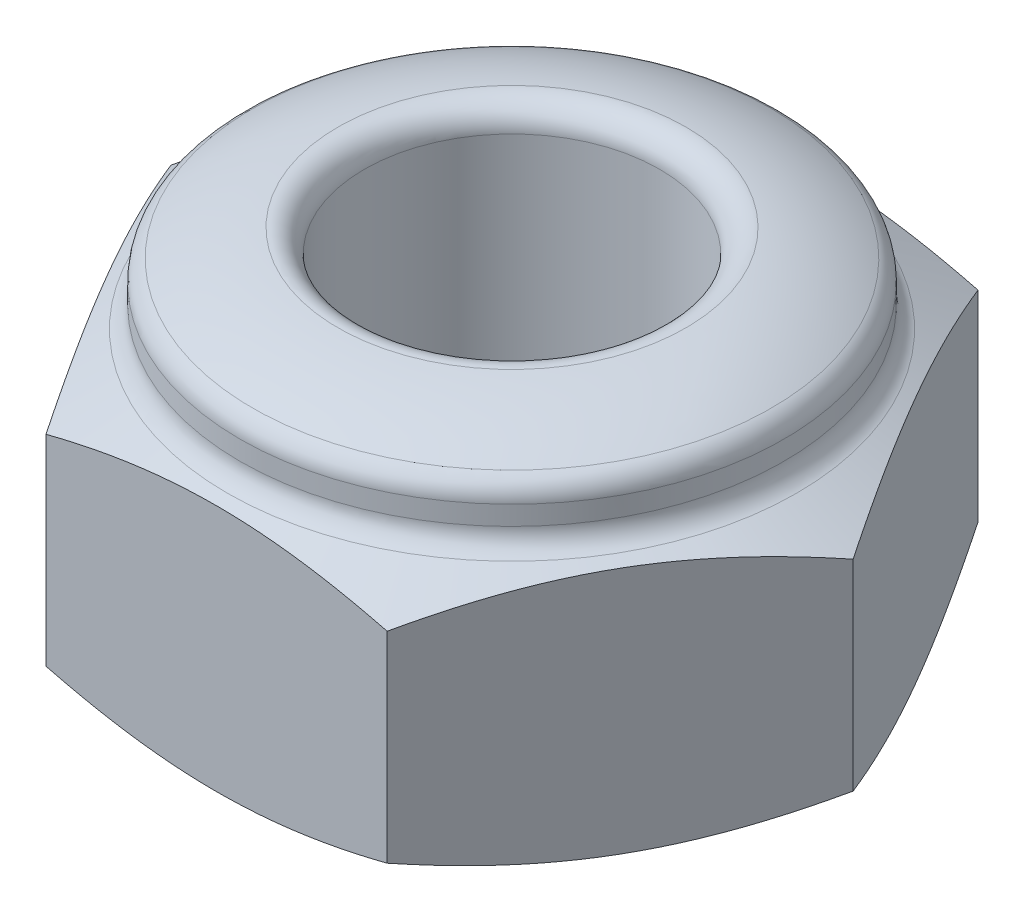
ISO-10303-21;
HEADER;
FILE_DESCRIPTION(('STEP AP214'),'2;1');
FILE_NAME('part.step','',(''),(''),'','','');
FILE_SCHEMA(('AUTOMOTIVE_DESIGN { 1 0 10303 214 1 1 1 1 }'));
ENDSEC;
DATA;
#1=APPLICATION_CONTEXT('core data for automotive mechanical design processes');
#2=APPLICATION_PROTOCOL_DEFINITION('international standard','automotive_design',2000,#1);
#3=PRODUCT_CONTEXT('',#1,'mechanical');
#4=PRODUCT('Part','Part','',(#3));
#5=PRODUCT_RELATED_PRODUCT_CATEGORY('part','',(#4));
#6=PRODUCT_DEFINITION_FORMATION('','',#4);
#7=PRODUCT_DEFINITION_CONTEXT('part definition',#1,'design');
#8=PRODUCT_DEFINITION('design','',#6,#7);
#9=PRODUCT_DEFINITION_SHAPE('','',#8);
#10=(LENGTH_UNIT() NAMED_UNIT(*) SI_UNIT(.MILLI.,.METRE.));
#11=(NAMED_UNIT(*) PLANE_ANGLE_UNIT() SI_UNIT($,.RADIAN.));
#12=(NAMED_UNIT(*) SI_UNIT($,.STERADIAN.) SOLID_ANGLE_UNIT());
#13=UNCERTAINTY_MEASURE_WITH_UNIT(LENGTH_MEASURE(1.E-05),#10,'distance_accuracy_value','');
#14=(GEOMETRIC_REPRESENTATION_CONTEXT(3) GLOBAL_UNCERTAINTY_ASSIGNED_CONTEXT((#13)) GLOBAL_UNIT_ASSIGNED_CONTEXT((#10,
#11,#12)) REPRESENTATION_CONTEXT('',''));
#15=CARTESIAN_POINT('',(0.,0.,0.));
#16=DIRECTION('',(0.,0.,1.));
#17=DIRECTION('',(1.,0.,0.));
#18=AXIS2_PLACEMENT_3D('',#15,#16,#17);
#19=CARTESIAN_POINT('',(0.,-1.15,0.));
#20=DIRECTION('',(0.,1.,0.));
#21=DIRECTION('',(0.,0.,1.));
#22=AXIS2_PLACEMENT_3D('',#19,#20,#21);
#23=PLANE('',#22);
#24=CARTESIAN_POINT('',(0.,-1.15,0.));
#25=DIRECTION('',(0.,1.,0.));
#26=DIRECTION('',(0.,0.,1.));
#27=AXIS2_PLACEMENT_3D('',#24,#25,#26);
#28=CIRCLE('',#27,1.25);
#29=CARTESIAN_POINT('',(0.,-1.15,1.25));
#30=VERTEX_POINT('',#29);
#31=EDGE_CURVE('E235',#30,#30,#28,.T.);
#32=ORIENTED_EDGE('',*,*,#31,.T.);
#33=EDGE_LOOP('',(#32));
#34=FACE_BOUND('',#33,.T.);
#35=CARTESIAN_POINT('',(0.,-1.15,0.));
#36=DIRECTION('',(0.,1.,0.));
#37=DIRECTION('',(0.,0.,1.));
#38=AXIS2_PLACEMENT_3D('',#35,#36,#37);
#39=CIRCLE('',#38,2.30000000000003);
#40=CARTESIAN_POINT('',(0.,-1.15,2.30000000000003));
#41=VERTEX_POINT('',#40);
#42=EDGE_CURVE('E238',#41,#41,#39,.T.);
#43=ORIENTED_EDGE('',*,*,#42,.F.);
#44=EDGE_LOOP('',(#43));
#45=FACE_BOUND('',#44,.T.);
#46=ADVANCED_FACE('F35',(#34,#45),#23,.F.);
#47=CARTESIAN_POINT('',(1.44337567297409,1.15,2.49999999999999));
#48=DIRECTION('',(-0.866025403784441,0.,-0.499999999999995));
#49=DIRECTION('',(-0.499999999999995,0.,0.866025403784442));
#50=AXIS2_PLACEMENT_3D('',#47,#48,#49);
#51=PLANE('',#50);
#52=DIRECTION('',(0.,-1.,0.));
#53=VECTOR('',#52,1.);
#54=CARTESIAN_POINT('',(1.44337567297409,1.15,2.49999999999999));
#55=LINE('',#54,#53);
#56=CARTESIAN_POINT('',(1.44337567297417,0.85,2.49999999999999));
#57=VERTEX_POINT('',#56);
#58=CARTESIAN_POINT('',(1.44337567297409,-0.850000000000019,2.49999999999999));
#59=VERTEX_POINT('',#58);
#60=EDGE_CURVE('E102',#57,#59,#55,.T.);
#61=ORIENTED_EDGE('',*,*,#60,.T.);
#62=CARTESIAN_POINT('',(1.44326020292026,-0.849940957792842,2.50019999999999));
#63=CARTESIAN_POINT('',(1.48304200436103,-0.870275913021248,2.43129589868794));
#64=CARTESIAN_POINT('',(1.52297171977333,-0.88943828497677,2.36213560286208));
#65=CARTESIAN_POINT('',(1.60315528144172,-0.925022276588077,2.22325360012059));
#66=CARTESIAN_POINT('',(1.64340928110925,-0.941442508167529,2.15353162748857));
#67=CARTESIAN_POINT('',(1.7647467778341,-0.98600599889985,1.9433689182979));
#68=CARTESIAN_POINT('',(1.84630037490682,-1.00939599507613,1.80211394462795));
#69=CARTESIAN_POINT('',(1.96821494245454,-1.03261787149011,1.5909517194525));
#70=CARTESIAN_POINT('',(2.008307412772,-1.03838013773711,1.52150952386173));
#71=CARTESIAN_POINT('',(2.08858324859441,-1.0460025287005,1.38246769759725));
#72=CARTESIAN_POINT('',(2.12876660075624,-1.0478631931826,1.31286809003452));
#73=CARTESIAN_POINT('',(2.20908795497129,-1.04760865942046,1.17374742360132));
#74=CARTESIAN_POINT('',(2.24922596105515,-1.04549755958155,1.10422635774957));
#75=CARTESIAN_POINT('',(2.32939940188051,-1.03738839638708,0.965361884822419));
#76=CARTESIAN_POINT('',(2.3694348448531,-1.03139065542793,0.896018463490371));
#77=CARTESIAN_POINT('',(2.44942482862501,-1.01570084263161,0.757471747500809));
#78=CARTESIAN_POINT('',(2.48937890672737,-1.0059994399089,0.688269254257944));
#79=CARTESIAN_POINT('',(2.56904987868748,-0.983213414244998,0.550275082934642));
#80=CARTESIAN_POINT('',(2.60876673138533,-0.970128220698126,0.481483476145227));
#81=CARTESIAN_POINT('',(2.68840407449965,-0.940762434342736,0.343547551691429));
#82=CARTESIAN_POINT('',(2.72832109885332,-0.924444659193758,0.274409237423899));
#83=CARTESIAN_POINT('',(2.80783255799786,-0.889116076286036,0.136691350401629));
#84=CARTESIAN_POINT('',(2.84742716860096,-0.870106856989903,0.0681114731311524));
#85=CARTESIAN_POINT('',(2.88686681600197,-0.849940957792858,-0.00020000000000055));
#86=B_SPLINE_CURVE_WITH_KNOTS('',3,(#62,#63,#64,#65,#66,#67,#68,#69,#70,#71,#72,#73,#74,#75,#76,
#77,#78,#79,#80,#81,#82,#83,#84,#85),.UNSPECIFIED.,.F.,.F.,(4,2,2,2,2,2,2,2,2,2,2,4),(0.,
0.246339561475915,0.492803444956308,0.986384137280997,1.22748103973818,1.46854458552913,
1.70935951780852,1.9501544770742,2.19156013413322,2.43300652579168,2.6774108286129,
2.9216714831912),.UNSPECIFIED.);
#87=CARTESIAN_POINT('',(2.88675134594818,-0.85,0.));
#88=VERTEX_POINT('',#87);
#89=EDGE_CURVE('E50',#59,#88,#86,.T.);
#90=ORIENTED_EDGE('',*,*,#89,.T.);
#91=DIRECTION('',(0.,-1.,0.));
#92=VECTOR('',#91,1.);
#93=CARTESIAN_POINT('',(2.88675134594813,1.15,0.));
#94=LINE('',#93,#92);
#95=CARTESIAN_POINT('',(2.88675134594818,0.85,0.));
#96=VERTEX_POINT('',#95);
#97=EDGE_CURVE('E100',#96,#88,#94,.T.);
#98=ORIENTED_EDGE('',*,*,#97,.F.);
#99=CARTESIAN_POINT('',(2.88686681600197,0.849940957792849,-0.00019999999999984));
#100=CARTESIAN_POINT('',(2.84708501456119,0.870275913021254,0.0687041013120405));
#101=CARTESIAN_POINT('',(2.8071552991489,0.889438284976776,0.137864397137907));
#102=CARTESIAN_POINT('',(2.72697173748051,0.925022276588082,0.27674639987939));
#103=CARTESIAN_POINT('',(2.68671773781298,0.941442508167534,0.346468372511408));
#104=CARTESIAN_POINT('',(2.56538024108813,0.986005998899853,0.556631081702078));
#105=CARTESIAN_POINT('',(2.48382664401541,1.00939599507613,0.697886055372031));
#106=CARTESIAN_POINT('',(2.36191207646768,1.03261787149011,0.909048280547479));
#107=CARTESIAN_POINT('',(2.32181960615023,1.03838013773711,0.978490476138252));
#108=CARTESIAN_POINT('',(2.24154377032782,1.0460025287005,1.11753230240273));
#109=CARTESIAN_POINT('',(2.20136041816599,1.0478631931826,1.18713190996545));
#110=CARTESIAN_POINT('',(2.12103906395094,1.04760865942046,1.32625257639866));
#111=CARTESIAN_POINT('',(2.08090105786708,1.04549755958155,1.39577364225041));
#112=CARTESIAN_POINT('',(2.00072761704172,1.03738839638707,1.53463811517756));
#113=CARTESIAN_POINT('',(1.96069217406913,1.03139065542793,1.6039815365096));
#114=CARTESIAN_POINT('',(1.88070219029722,1.01570084263161,1.74252825249917));
#115=CARTESIAN_POINT('',(1.84074811219486,1.0059994399089,1.81173074574203));
#116=CARTESIAN_POINT('',(1.76107714023475,0.983213414244995,1.94972491706534));
#117=CARTESIAN_POINT('',(1.7213602875369,0.970128220698123,2.01851652385475));
#118=CARTESIAN_POINT('',(1.64172294442258,0.940762434342732,2.15645244830855));
#119=CARTESIAN_POINT('',(1.6018059200689,0.924444659193753,2.22559076257608));
#120=CARTESIAN_POINT('',(1.52229446092437,0.88911607628603,2.36330864959836));
#121=CARTESIAN_POINT('',(1.48269985032127,0.870106856989896,2.43188852686883));
#122=CARTESIAN_POINT('',(1.44326020292026,0.849940957792851,2.50019999999999));
#123=B_SPLINE_CURVE_WITH_KNOTS('',3,(#99,#100,#101,#102,#103,#104,#105,#106,#107,#108,#109,#110,
#111,#112,#113,#114,#115,#116,#117,#118,#119,#120,#121,#122),.UNSPECIFIED.,.F.,.F.,(4,2,2,2,2,2,
2,2,2,2,2,4),(0.,0.246339561475913,0.492803444956304,0.98638413728099,1.22748103973818,
1.46854458552912,1.70935951780851,1.95015447707418,2.19156013413321,2.43300652579167,
2.6774108286129,2.9216714831912),.UNSPECIFIED.);
#124=EDGE_CURVE('E171',#96,#57,#123,.T.);
#125=ORIENTED_EDGE('',*,*,#124,.T.);
#126=EDGE_LOOP('',(#61,#90,#98,#125));
#127=FACE_BOUND('',#126,.T.);
#128=ADVANCED_FACE('F98',(#127),#51,.F.);
#129=CARTESIAN_POINT('',(2.88675134594813,1.15,0.));
#130=DIRECTION('',(-0.866025403784438,0.,0.500000000000001));
#131=DIRECTION('',(0.500000000000001,0.,0.866025403784438));
#132=AXIS2_PLACEMENT_3D('',#129,#130,#131);
#133=PLANE('',#132);
#134=ORIENTED_EDGE('',*,*,#97,.T.);
#135=CARTESIAN_POINT('',(2.88686681600197,-0.849940957792849,0.000200000000000056));
#136=CARTESIAN_POINT('',(2.84708501456119,-0.870275913021255,-0.0687041013120404));
#137=CARTESIAN_POINT('',(2.80715529914889,-0.889438284976777,-0.137864397137907));
#138=CARTESIAN_POINT('',(2.7269717374805,-0.925022276588083,-0.27674639987939));
#139=CARTESIAN_POINT('',(2.68671773781298,-0.941442508167536,-0.346468372511408));
#140=CARTESIAN_POINT('',(2.56538024108812,-0.986005998899856,-0.556631081702077));
#141=CARTESIAN_POINT('',(2.4838266440154,-1.00939599507614,-0.69788605537203));
#142=CARTESIAN_POINT('',(2.36191207646768,-1.03261787149012,-0.909048280547477));
#143=CARTESIAN_POINT('',(2.32181960615023,-1.03838013773711,-0.97849047613825));
#144=CARTESIAN_POINT('',(2.24154377032781,-1.0460025287005,-1.11753230240273));
#145=CARTESIAN_POINT('',(2.20136041816598,-1.0478631931826,-1.18713190996545));
#146=CARTESIAN_POINT('',(2.12103906395093,-1.04760865942047,-1.32625257639865));
#147=CARTESIAN_POINT('',(2.08090105786707,-1.04549755958156,-1.39577364225041));
#148=CARTESIAN_POINT('',(2.00072761704171,-1.03738839638708,-1.53463811517755));
#149=CARTESIAN_POINT('',(1.96069217406912,-1.03139065542794,-1.6039815365096));
#150=CARTESIAN_POINT('',(1.88070219029721,-1.01570084263161,-1.74252825249916));
#151=CARTESIAN_POINT('',(1.84074811219484,-1.00599943990891,-1.81173074574203));
#152=CARTESIAN_POINT('',(1.76107714023473,-0.983213414245,-1.94972491706534));
#153=CARTESIAN_POINT('',(1.72136028753688,-0.970128220698128,-2.01851652385476));
#154=CARTESIAN_POINT('',(1.64172294442255,-0.940762434342736,-2.15645244830856));
#155=CARTESIAN_POINT('',(1.60180592006888,-0.924444659193756,-2.2255907625761));
#156=CARTESIAN_POINT('',(1.52229446092434,-0.889116076286032,-2.36330864959837));
#157=CARTESIAN_POINT('',(1.48269985032123,-0.870106856989897,-2.43188852686885));
#158=CARTESIAN_POINT('',(1.44326020292022,-0.849940957792851,-2.50020000000001));
#159=B_SPLINE_CURVE_WITH_KNOTS('',3,(#135,#136,#137,#138,#139,#140,#141,#142,#143,#144,#145,
#146,#147,#148,#149,#150,#151,#152,#153,#154,#155,#156,#157,#158),.UNSPECIFIED.,.F.,.F.,(4,2,2,
2,2,2,2,2,2,2,2,4),(0.,0.246339561475914,0.492803444956306,0.986384137280993,1.22748103973818,
1.46854458552913,1.70935951780852,1.95015447707419,2.19156013413323,2.43300652579169,
2.67741082861292,2.92167148319123),.UNSPECIFIED.);
#160=CARTESIAN_POINT('',(1.44337567297414,-0.85,-2.50000000000001));
#161=VERTEX_POINT('',#160);
#162=EDGE_CURVE('E86',#88,#161,#159,.T.);
#163=ORIENTED_EDGE('',*,*,#162,.T.);
#164=DIRECTION('',(0.,-1.,0.));
#165=VECTOR('',#164,1.);
#166=CARTESIAN_POINT('',(1.44337567297406,1.15,-2.50000000000001));
#167=LINE('',#166,#165);
#168=CARTESIAN_POINT('',(1.44337567297414,0.85,-2.50000000000001));
#169=VERTEX_POINT('',#168);
#170=EDGE_CURVE('E108',#169,#161,#167,.T.);
#171=ORIENTED_EDGE('',*,*,#170,.F.);
#172=CARTESIAN_POINT('',(1.44326020292022,0.849940957792842,-2.50020000000001));
#173=CARTESIAN_POINT('',(1.483042004361,0.870275913021248,-2.43129589868796));
#174=CARTESIAN_POINT('',(1.5229717197733,0.889438284976771,-2.3621356028621));
#175=CARTESIAN_POINT('',(1.60315528144169,0.925022276588078,-2.22325360012061));
#176=CARTESIAN_POINT('',(1.64340928110921,0.941442508167531,-2.1535316274886));
#177=CARTESIAN_POINT('',(1.76474677783407,0.986005998899852,-1.94336891829792));
#178=CARTESIAN_POINT('',(1.84630037490679,1.00939599507613,-1.80211394462797));
#179=CARTESIAN_POINT('',(1.96821494245452,1.03261787149012,-1.59095171945252));
#180=CARTESIAN_POINT('',(2.00830741277197,1.03838013773711,-1.52150952386175));
#181=CARTESIAN_POINT('',(2.08858324859438,1.0460025287005,-1.38246769759727));
#182=CARTESIAN_POINT('',(2.12876660075621,1.0478631931826,-1.31286809003455));
#183=CARTESIAN_POINT('',(2.20908795497126,1.04760865942047,-1.17374742360134));
#184=CARTESIAN_POINT('',(2.24922596105513,1.04549755958156,-1.10422635774959));
#185=CARTESIAN_POINT('',(2.32939940188049,1.03738839638708,-0.965361884822442));
#186=CARTESIAN_POINT('',(2.36943484485308,1.03139065542794,-0.896018463490393));
#187=CARTESIAN_POINT('',(2.44942482862499,1.01570084263161,-0.75747174750083));
#188=CARTESIAN_POINT('',(2.48937890672735,1.00599943990891,-0.688269254257963));
#189=CARTESIAN_POINT('',(2.56904987868746,0.983213414245003,-0.550275082934656));
#190=CARTESIAN_POINT('',(2.60876673138532,0.970128220698131,-0.481483476145239));
#191=CARTESIAN_POINT('',(2.68840407449964,0.94076243434274,-0.343547551691438));
#192=CARTESIAN_POINT('',(2.72832109885332,0.924444659193761,-0.274409237423906));
#193=CARTESIAN_POINT('',(2.80783255799785,0.889116076286038,-0.136691350401632));
#194=CARTESIAN_POINT('',(2.84742716860096,0.870106856989903,-0.0681114731311541));
#195=CARTESIAN_POINT('',(2.88686681600197,0.849940957792858,0.000200000000000967));
#196=B_SPLINE_CURVE_WITH_KNOTS('',3,(#172,#173,#174,#175,#176,#177,#178,#179,#180,#181,#182,
#183,#184,#185,#186,#187,#188,#189,#190,#191,#192,#193,#194,#195),.UNSPECIFIED.,.F.,.F.,(4,2,2,
2,2,2,2,2,2,2,2,4),(0.,0.246339561475916,0.492803444956309,0.986384137281,1.22748103973819,
1.46854458552914,1.70935951780853,1.9501544770742,2.19156013413324,2.4330065257917,
2.67741082861293,2.92167148319123),.UNSPECIFIED.);
#197=EDGE_CURVE('E106',#169,#96,#196,.T.);
#198=ORIENTED_EDGE('',*,*,#197,.T.);
#199=EDGE_LOOP('',(#134,#163,#171,#198));
#200=FACE_BOUND('',#199,.T.);
#201=ADVANCED_FACE('F105',(#200),#133,.F.);
#202=CARTESIAN_POINT('',(1.44337567297406,1.15,-2.50000000000001));
#203=DIRECTION('',(0.,0.,1.));
#204=DIRECTION('',(1.,0.,0.));
#205=AXIS2_PLACEMENT_3D('',#202,#203,#204);
#206=PLANE('',#205);
#207=ORIENTED_EDGE('',*,*,#170,.T.);
#208=CARTESIAN_POINT('',(4.34587361311277,0.237458154811676,-2.50000000000002));
#209=CARTESIAN_POINT('',(4.22613575360741,0.184404104682634,-2.50000000000001));
#210=CARTESIAN_POINT('',(4.1062025547838,0.13178444358232,-2.50000000000001));
#211=CARTESIAN_POINT('',(3.86583750401857,0.0276642732761254,-2.50000000000001));
#212=CARTESIAN_POINT('',(3.74540560322869,-0.023836123054455,-2.50000000000001));
#213=CARTESIAN_POINT('',(3.50360609912637,-0.125605239165463,-2.50000000000001));
#214=CARTESIAN_POINT('',(3.38223678932978,-0.175869916174756,-2.50000000000001));
#215=CARTESIAN_POINT('',(3.13879002351803,-0.274648468388736,-2.50000000000001));
#216=CARTESIAN_POINT('',(3.01671258916653,-0.323162396829636,-2.50000000000001));
#217=CARTESIAN_POINT('',(2.77143659534895,-0.418066296864358,-2.50000000000001));
#218=CARTESIAN_POINT('',(2.64823622181114,-0.464451601579476,-2.50000000000001));
#219=CARTESIAN_POINT('',(2.40079325665039,-0.554347350801867,-2.50000000000001));
#220=CARTESIAN_POINT('',(2.27655072122877,-0.597857949226153,-2.50000000000001));
#221=CARTESIAN_POINT('',(2.0268930920685,-0.681126486381562,-2.50000000000001));
#222=CARTESIAN_POINT('',(1.90147883876774,-0.720886917245262,-2.50000000000001));
#223=CARTESIAN_POINT('',(1.64923272914206,-0.795561558144086,-2.50000000000001));
#224=CARTESIAN_POINT('',(1.52240109352089,-0.830476511624052,-2.50000000000001));
#225=CARTESIAN_POINT('',(1.2279112141293,-0.903829645269126,-2.5));
#226=CARTESIAN_POINT('',(1.05967649430544,-0.940057046103863,-2.5));
#227=CARTESIAN_POINT('',(0.805529635896037,-0.983646986111996,-2.5));
#228=CARTESIAN_POINT('',(0.720530950577388,-0.996383728491125,-2.5));
#229=CARTESIAN_POINT('',(0.550033961713094,-1.01785212074504,-2.5));
#230=CARTESIAN_POINT('',(0.464535739119156,-1.02658440227139,-2.5));
#231=CARTESIAN_POINT('',(0.293370556151716,-1.03969684893678,-2.5));
#232=CARTESIAN_POINT('',(0.207704250443258,-1.04408547196346,-2.5));
#233=CARTESIAN_POINT('',(0.0362589448771357,-1.04835730536555,-2.5));
#234=CARTESIAN_POINT('',(-0.0495200535257338,-1.04824057334186,-2.5));
#235=CARTESIAN_POINT('',(-0.220939893356359,-1.04350621120751,-2.5));
#236=CARTESIAN_POINT('',(-0.306580753705786,-1.03888926136928,-2.5));
#237=CARTESIAN_POINT('',(-0.477525824997255,-1.02535045311828,-2.5));
#238=CARTESIAN_POINT('',(-0.562829987274483,-1.01642799383534,-2.5));
#239=CARTESIAN_POINT('',(-0.807043784518116,-0.985097564079737,-2.5));
#240=CARTESIAN_POINT('',(-0.965323989872185,-0.957713331320902,-2.5));
#241=CARTESIAN_POINT('',(-1.27958845813876,-0.891920978802273,-2.5));
#242=CARTESIAN_POINT('',(-1.43557113320953,-0.853505579534545,-2.5));
#243=CARTESIAN_POINT('',(-1.74604098127096,-0.768300675878605,-2.49999999999999));
#244=CARTESIAN_POINT('',(-1.90051660451126,-0.721469811212012,-2.49999999999999));
#245=CARTESIAN_POINT('',(-2.20746583561587,-0.621840584460346,-2.49999999999999));
#246=CARTESIAN_POINT('',(-2.35993986726562,-0.569043509076389,-2.49999999999999));
#247=CARTESIAN_POINT('',(-2.66794333182038,-0.457430195575799,-2.49999999999999));
#248=CARTESIAN_POINT('',(-2.82342352420293,-0.398479223604534,-2.49999999999999));
#249=CARTESIAN_POINT('',(-3.13307330231513,-0.277214585109686,-2.49999999999999));
#250=CARTESIAN_POINT('',(-3.28724277773182,-0.214900638730755,-2.49999999999999));
#251=CARTESIAN_POINT('',(-3.59261725095966,-0.0885892425457314,-2.49999999999999));
#252=CARTESIAN_POINT('',(-3.74383514731852,-0.0246228195387622,-2.49999999999999));
#253=CARTESIAN_POINT('',(-4.04542645331375,0.105162342831155,-2.49999999999999));
#254=CARTESIAN_POINT('',(-4.19580008175662,0.170980572904022,-2.49999999999999));
#255=CARTESIAN_POINT('',(-4.34587361311278,0.237458154811699,-2.49999999999999));
#256=B_SPLINE_CURVE_WITH_KNOTS('',3,(#208,#209,#210,#211,#212,#213,#214,#215,#216,#217,#218,
#219,#220,#221,#222,#223,#224,#225,#226,#227,#228,#229,#230,#231,#232,#233,#234,#235,#236,#237,
#238,#239,#240,#241,#242,#243,#244,#245,#246,#247,#248,#249,#250,#251,#252,#253,#254,#255),
.UNSPECIFIED.,.F.,.F.,(4,2,2,2,2,2,2,2,2,2,2,2,2,2,2,2,2,2,2,2,2,2,2,4),(0.,0.392898697877062,
0.785836836535172,1.17992419086486,1.57399955179503,1.9689012219793,2.3637817312452,
2.75839795034677,3.15295355612053,3.66867539781896,3.92643992380949,4.18416377680482,
4.44138480178148,4.69860253819164,4.95578139848303,5.21299616063957,5.69432918948238,
6.17598058462,6.66006737935727,7.14404997218841,7.64283974963129,8.14167109886691,
8.63422918349652,9.1266531024332),.UNSPECIFIED.);
#257=CARTESIAN_POINT('',(-1.44337567297407,-0.85,-2.50000000000002));
#258=VERTEX_POINT('',#257);
#259=EDGE_CURVE('E89',#161,#258,#256,.T.);
#260=ORIENTED_EDGE('',*,*,#259,.T.);
#261=DIRECTION('',(0.,-1.,0.));
#262=VECTOR('',#261,1.);
#263=CARTESIAN_POINT('',(-1.44337567297408,1.15,-2.5));
#264=LINE('',#263,#262);
#265=CARTESIAN_POINT('',(-1.44337567297407,0.85,-2.50000000000002));
#266=VERTEX_POINT('',#265);
#267=EDGE_CURVE('E112',#266,#258,#264,.T.);
#268=ORIENTED_EDGE('',*,*,#267,.F.);
#269=CARTESIAN_POINT('',(-4.34587361311278,-0.2374581548117,-2.49999999999999));
#270=CARTESIAN_POINT('',(-4.22613575360743,-0.184404104682657,-2.49999999999999));
#271=CARTESIAN_POINT('',(-4.10620255478381,-0.131784443582342,-2.49999999999999));
#272=CARTESIAN_POINT('',(-3.86583750401859,-0.027664273276146,-2.49999999999999));
#273=CARTESIAN_POINT('',(-3.7454056032287,0.0238361230544352,-2.49999999999999));
#274=CARTESIAN_POINT('',(-3.50360609912638,0.125605239165444,-2.49999999999999));
#275=CARTESIAN_POINT('',(-3.38223678932979,0.175869916174738,-2.49999999999999));
#276=CARTESIAN_POINT('',(-3.13879002351804,0.274648468388719,-2.49999999999999));
#277=CARTESIAN_POINT('',(-3.01671258916654,0.32316239682962,-2.49999999999999));
#278=CARTESIAN_POINT('',(-2.77143659534896,0.418066296864343,-2.49999999999999));
#279=CARTESIAN_POINT('',(-2.64823622181114,0.464451601579462,-2.49999999999999));
#280=CARTESIAN_POINT('',(-2.40079325665039,0.554347350801855,-2.49999999999999));
#281=CARTESIAN_POINT('',(-2.27655072122877,0.597857949226141,-2.49999999999999));
#282=CARTESIAN_POINT('',(-2.0268930920685,0.681126486381552,-2.49999999999999));
#283=CARTESIAN_POINT('',(-1.90147883876773,0.720886917245252,-2.49999999999999));
#284=CARTESIAN_POINT('',(-1.64923272914205,0.795561558144078,-2.49999999999999));
#285=CARTESIAN_POINT('',(-1.52240109352088,0.830476511624044,-2.49999999999999));
#286=CARTESIAN_POINT('',(-1.22791121412929,0.90382964526912,-2.5));
#287=CARTESIAN_POINT('',(-1.05967649430544,0.940057046103858,-2.5));
#288=CARTESIAN_POINT('',(-0.805529635896028,0.983646986111992,-2.5));
#289=CARTESIAN_POINT('',(-0.720530950577378,0.996383728491121,-2.5));
#290=CARTESIAN_POINT('',(-0.550033961713084,1.01785212074504,-2.5));
#291=CARTESIAN_POINT('',(-0.464535739119146,1.02658440227138,-2.5));
#292=CARTESIAN_POINT('',(-0.293370556151706,1.03969684893678,-2.5));
#293=CARTESIAN_POINT('',(-0.207704250443248,1.04408547196346,-2.5));
#294=CARTESIAN_POINT('',(-0.0362589448771249,1.04835730536555,-2.5));
#295=CARTESIAN_POINT('',(0.0495200535257452,1.04824057334186,-2.5));
#296=CARTESIAN_POINT('',(0.220939893356371,1.04350621120751,-2.5));
#297=CARTESIAN_POINT('',(0.306580753705797,1.03888926136928,-2.5));
#298=CARTESIAN_POINT('',(0.477525824997267,1.02535045311829,-2.5));
#299=CARTESIAN_POINT('',(0.562829987274496,1.01642799383534,-2.5));
#300=CARTESIAN_POINT('',(0.807043784518127,0.98509756407974,-2.5));
#301=CARTESIAN_POINT('',(0.965323989872195,0.957713331320907,-2.5));
#302=CARTESIAN_POINT('',(1.27958845813877,0.891920978802278,-2.5));
#303=CARTESIAN_POINT('',(1.43557113320954,0.853505579534552,-2.50000000000001));
#304=CARTESIAN_POINT('',(1.74604098127096,0.768300675878613,-2.50000000000001));
#305=CARTESIAN_POINT('',(1.90051660451126,0.721469811212021,-2.50000000000001));
#306=CARTESIAN_POINT('',(2.20746583561587,0.621840584460357,-2.50000000000001));
#307=CARTESIAN_POINT('',(2.35993986726562,0.569043509076401,-2.50000000000001));
#308=CARTESIAN_POINT('',(2.66794333182038,0.457430195575813,-2.50000000000001));
#309=CARTESIAN_POINT('',(2.82342352420292,0.398479223604548,-2.50000000000001));
#310=CARTESIAN_POINT('',(3.13307330231512,0.277214585109702,-2.50000000000001));
#311=CARTESIAN_POINT('',(3.28724277773182,0.214900638730772,-2.50000000000001));
#312=CARTESIAN_POINT('',(3.59261725095965,0.0885892425457498,-2.50000000000001));
#313=CARTESIAN_POINT('',(3.74383514731851,0.0246228195387814,-2.50000000000001));
#314=CARTESIAN_POINT('',(4.04542645331373,-0.105162342831134,-2.50000000000001));
#315=CARTESIAN_POINT('',(4.19580008175661,-0.170980572904,-2.50000000000001));
#316=CARTESIAN_POINT('',(4.34587361311277,-0.237458154811677,-2.50000000000002));
#317=B_SPLINE_CURVE_WITH_KNOTS('',3,(#269,#270,#271,#272,#273,#274,#275,#276,#277,#278,#279,
#280,#281,#282,#283,#284,#285,#286,#287,#288,#289,#290,#291,#292,#293,#294,#295,#296,#297,#298,
#299,#300,#301,#302,#303,#304,#305,#306,#307,#308,#309,#310,#311,#312,#313,#314,#315,#316),
.UNSPECIFIED.,.F.,.F.,(4,2,2,2,2,2,2,2,2,2,2,2,2,2,2,2,2,2,2,2,2,2,2,4),(0.,0.392898697877065,
0.785836836535179,1.17992419086487,1.57399955179504,1.96890122197932,2.36378173124523,
2.7583979503468,3.15295355612056,3.66867539781899,3.92643992380953,4.18416377680485,
4.44138480178152,4.69860253819167,4.95578139848306,5.21299616063961,5.69432918948241,
6.17598058462002,6.66006737935729,7.14404997218843,7.6428397496313,8.14167109886692,
8.63422918349653,9.1266531024332),.UNSPECIFIED.);
#318=EDGE_CURVE('E159',#266,#169,#317,.T.);
#319=ORIENTED_EDGE('',*,*,#318,.T.);
#320=EDGE_LOOP('',(#207,#260,#268,#319));
#321=FACE_BOUND('',#320,.T.);
#322=ADVANCED_FACE('F180',(#321),#206,.F.);
#323=CARTESIAN_POINT('',(-1.44337567297408,1.15,-2.5));
#324=DIRECTION('',(0.866025403784442,0.,0.499999999999995));
#325=DIRECTION('',(0.499999999999995,0.,-0.866025403784442));
#326=AXIS2_PLACEMENT_3D('',#323,#324,#325);
#327=PLANE('',#326);
#328=ORIENTED_EDGE('',*,*,#267,.T.);
#329=CARTESIAN_POINT('',(-1.44326020292024,-0.849940957792829,-2.5002));
#330=CARTESIAN_POINT('',(-1.48304200436101,-0.870275913021235,-2.43129589868795));
#331=CARTESIAN_POINT('',(-1.52297171977331,-0.889438284976756,-2.36213560286209));
#332=CARTESIAN_POINT('',(-1.6031552814417,-0.925022276588063,-2.2232536001206));
#333=CARTESIAN_POINT('',(-1.64340928110923,-0.941442508167515,-2.15353162748858));
#334=CARTESIAN_POINT('',(-1.76474677783408,-0.986005998899835,-1.94336891829791));
#335=CARTESIAN_POINT('',(-1.8463003749068,-1.00939599507612,-1.80211394462796));
#336=CARTESIAN_POINT('',(-1.96821494245453,-1.0326178714901,-1.59095171945251));
#337=CARTESIAN_POINT('',(-2.00830741277198,-1.03838013773709,-1.52150952386173));
#338=CARTESIAN_POINT('',(-2.0885832485944,-1.04600252870048,-1.38246769759725));
#339=CARTESIAN_POINT('',(-2.12876660075623,-1.04786319318258,-1.31286809003453));
#340=CARTESIAN_POINT('',(-2.20908795497127,-1.04760865942044,-1.17374742360132));
#341=CARTESIAN_POINT('',(-2.24922596105514,-1.04549755958153,-1.10422635774957));
#342=CARTESIAN_POINT('',(-2.3293994018805,-1.03738839638706,-0.965361884822421));
#343=CARTESIAN_POINT('',(-2.36943484485308,-1.03139065542791,-0.896018463490372));
#344=CARTESIAN_POINT('',(-2.449424828625,-1.01570084263159,-0.757471747500809));
#345=CARTESIAN_POINT('',(-2.48937890672736,-1.00599943990888,-0.688269254257942));
#346=CARTESIAN_POINT('',(-2.56904987868747,-0.983213414244977,-0.550275082934636));
#347=CARTESIAN_POINT('',(-2.60876673138532,-0.970128220698105,-0.481483476145219));
#348=CARTESIAN_POINT('',(-2.68840407449965,-0.940762434342714,-0.343547551691417));
#349=CARTESIAN_POINT('',(-2.72832109885332,-0.924444659193734,-0.274409237423886));
#350=CARTESIAN_POINT('',(-2.80783255799786,-0.889116076286011,-0.136691350401612));
#351=CARTESIAN_POINT('',(-2.84742716860096,-0.870106856989876,-0.068111473131134));
#352=CARTESIAN_POINT('',(-2.88686681600197,-0.849940957792832,0.000200000000020978));
#353=B_SPLINE_CURVE_WITH_KNOTS('',3,(#329,#330,#331,#332,#333,#334,#335,#336,#337,#338,#339,
#340,#341,#342,#343,#344,#345,#346,#347,#348,#349,#350,#351,#352),.UNSPECIFIED.,.F.,.F.,(4,2,2,
2,2,2,2,2,2,2,2,4),(0.,0.246339561475916,0.49280344495631,0.986384137281002,1.22748103973819,
1.46854458552914,1.70935951780853,1.9501544770742,2.19156013413324,2.4330065257917,
2.67741082861293,2.92167148319123),.UNSPECIFIED.);
#354=CARTESIAN_POINT('',(-2.88675134594813,-0.85,0.));
#355=VERTEX_POINT('',#354);
#356=EDGE_CURVE('E199',#258,#355,#353,.T.);
#357=ORIENTED_EDGE('',*,*,#356,.T.);
#358=DIRECTION('',(0.,-1.,0.));
#359=VECTOR('',#358,1.);
#360=CARTESIAN_POINT('',(-2.88675134594813,1.15,0.));
#361=LINE('',#360,#359);
#362=CARTESIAN_POINT('',(-2.88675134594813,0.85,0.));
#363=VERTEX_POINT('',#362);
#364=EDGE_CURVE('E245',#363,#355,#361,.T.);
#365=ORIENTED_EDGE('',*,*,#364,.F.);
#366=CARTESIAN_POINT('',(-2.88686681600197,0.849940957792822,0.000200000000020158));
#367=CARTESIAN_POINT('',(-2.84708501456119,0.870275913021229,-0.0687041013120217));
#368=CARTESIAN_POINT('',(-2.80715529914889,0.889438284976751,-0.13786439713789));
#369=CARTESIAN_POINT('',(-2.7269717374805,0.925022276588058,-0.276746399879375));
#370=CARTESIAN_POINT('',(-2.68671773781298,0.941442508167511,-0.346468372511395));
#371=CARTESIAN_POINT('',(-2.56538024108812,0.986005998899831,-0.556631081702068));
#372=CARTESIAN_POINT('',(-2.4838266440154,1.00939599507611,-0.697886055372024));
#373=CARTESIAN_POINT('',(-2.36191207646767,1.0326178714901,-0.909048280547476));
#374=CARTESIAN_POINT('',(-2.32181960615022,1.03838013773709,-0.978490476138251));
#375=CARTESIAN_POINT('',(-2.24154377032781,1.04600252870048,-1.11753230240273));
#376=CARTESIAN_POINT('',(-2.20136041816598,1.04786319318258,-1.18713190996546));
#377=CARTESIAN_POINT('',(-2.12103906395093,1.04760865942044,-1.32625257639866));
#378=CARTESIAN_POINT('',(-2.08090105786707,1.04549755958154,-1.39577364225042));
#379=CARTESIAN_POINT('',(-2.0007276170417,1.03738839638706,-1.53463811517756));
#380=CARTESIAN_POINT('',(-1.96069217406912,1.03139065542791,-1.60398153650961));
#381=CARTESIAN_POINT('',(-1.8807021902972,1.01570084263159,-1.74252825249918));
#382=CARTESIAN_POINT('',(-1.84074811219484,1.00599943990888,-1.81173074574204));
#383=CARTESIAN_POINT('',(-1.76107714023474,0.98321341424498,-1.94972491706535));
#384=CARTESIAN_POINT('',(-1.72136028753688,0.970128220698107,-2.01851652385476));
#385=CARTESIAN_POINT('',(-1.64172294442256,0.940762434342717,-2.15645244830856));
#386=CARTESIAN_POINT('',(-1.60180592006888,0.924444659193738,-2.22559076257609));
#387=CARTESIAN_POINT('',(-1.52229446092435,0.889116076286017,-2.36330864959837));
#388=CARTESIAN_POINT('',(-1.48269985032125,0.870106856989882,-2.43188852686884));
#389=CARTESIAN_POINT('',(-1.44326020292024,0.849940957792838,-2.5002));
#390=B_SPLINE_CURVE_WITH_KNOTS('',3,(#366,#367,#368,#369,#370,#371,#372,#373,#374,#375,#376,
#377,#378,#379,#380,#381,#382,#383,#384,#385,#386,#387,#388,#389),.UNSPECIFIED.,.F.,.F.,(4,2,2,
2,2,2,2,2,2,2,2,4),(0.,0.246339561475918,0.492803444956314,0.986384137281009,1.2274810397382,
1.46854458552915,1.70935951780854,1.95015447707422,2.19156013413325,2.43300652579171,
2.67741082861293,2.92167148319123),.UNSPECIFIED.);
#391=EDGE_CURVE('E152',#363,#266,#390,.T.);
#392=ORIENTED_EDGE('',*,*,#391,.T.);
#393=EDGE_LOOP('',(#328,#357,#365,#392));
#394=FACE_BOUND('',#393,.T.);
#395=ADVANCED_FACE('F212',(#394),#327,.F.);
#396=CARTESIAN_POINT('',(-2.88675134594813,1.15,0.));
#397=DIRECTION('',(0.866025403784435,0.,-0.500000000000007));
#398=DIRECTION('',(-0.500000000000007,0.,-0.866025403784435));
#399=AXIS2_PLACEMENT_3D('',#396,#397,#398);
#400=PLANE('',#399);
#401=ORIENTED_EDGE('',*,*,#364,.T.);
#402=CARTESIAN_POINT('',(-2.88686681600197,-0.849940957792822,-0.000199999999979888));
#403=CARTESIAN_POINT('',(-2.84708501456119,-0.870275913021229,0.0687041013120613));
#404=CARTESIAN_POINT('',(-2.80715529914889,-0.889438284976751,0.137864397137929));
#405=CARTESIAN_POINT('',(-2.7269717374805,-0.925022276588058,0.276746399879414));
#406=CARTESIAN_POINT('',(-2.68671773781297,-0.941442508167511,0.346468372511432));
#407=CARTESIAN_POINT('',(-2.56538024108811,-0.986005998899832,0.556631081702105));
#408=CARTESIAN_POINT('',(-2.48382664401539,-1.00939599507611,0.697886055372059));
#409=CARTESIAN_POINT('',(-2.36191207646766,-1.0326178714901,0.909048280547509));
#410=CARTESIAN_POINT('',(-2.32181960615021,-1.03838013773709,0.978490476138283));
#411=CARTESIAN_POINT('',(-2.24154377032779,-1.04600252870048,1.11753230240276));
#412=CARTESIAN_POINT('',(-2.20136041816596,-1.04786319318258,1.18713190996549));
#413=CARTESIAN_POINT('',(-2.12103906395091,-1.04760865942044,1.32625257639869));
#414=CARTESIAN_POINT('',(-2.08090105786705,-1.04549755958153,1.39577364225045));
#415=CARTESIAN_POINT('',(-2.00072761704168,-1.03738839638706,1.53463811517759));
#416=CARTESIAN_POINT('',(-1.96069217406909,-1.03139065542791,1.60398153650964));
#417=CARTESIAN_POINT('',(-1.88070219029718,-1.01570084263159,1.7425282524992));
#418=CARTESIAN_POINT('',(-1.84074811219482,-1.00599943990888,1.81173074574207));
#419=CARTESIAN_POINT('',(-1.76107714023471,-0.983213414244979,1.94972491706537));
#420=CARTESIAN_POINT('',(-1.72136028753685,-0.970128220698107,2.01851652385479));
#421=CARTESIAN_POINT('',(-1.64172294442253,-0.940762434342717,2.15645244830859));
#422=CARTESIAN_POINT('',(-1.60180592006885,-0.924444659193738,2.22559076257612));
#423=CARTESIAN_POINT('',(-1.52229446092432,-0.889116076286017,2.36330864959839));
#424=CARTESIAN_POINT('',(-1.48269985032122,-0.870106856989883,2.43188852686886));
#425=CARTESIAN_POINT('',(-1.4432602029202,-0.849940957792838,2.50020000000002));
#426=B_SPLINE_CURVE_WITH_KNOTS('',3,(#402,#403,#404,#405,#406,#407,#408,#409,#410,#411,#412,
#413,#414,#415,#416,#417,#418,#419,#420,#421,#422,#423,#424,#425),.UNSPECIFIED.,.F.,.F.,(4,2,2,
2,2,2,2,2,2,2,2,4),(0.,0.246339561475918,0.492803444956314,0.98638413728101,1.2274810397382,
1.46854458552915,1.70935951780855,1.95015447707422,2.19156013413325,2.43300652579171,
2.67741082861293,2.92167148319123),.UNSPECIFIED.);
#427=CARTESIAN_POINT('',(-1.44337567297407,-0.85,2.50000000000002));
#428=VERTEX_POINT('',#427);
#429=EDGE_CURVE('E206',#355,#428,#426,.T.);
#430=ORIENTED_EDGE('',*,*,#429,.T.);
#431=DIRECTION('',(0.,-1.,0.));
#432=VECTOR('',#431,1.);
#433=CARTESIAN_POINT('',(-1.44337567297404,1.15,2.50000000000002));
#434=LINE('',#433,#432);
#435=CARTESIAN_POINT('',(-1.44337567297404,0.850000000000006,2.50000000000002));
#436=VERTEX_POINT('',#435);
#437=EDGE_CURVE('E243',#436,#428,#434,.T.);
#438=ORIENTED_EDGE('',*,*,#437,.F.);
#439=CARTESIAN_POINT('',(-1.4432602029202,0.849940957792829,2.50020000000002));
#440=CARTESIAN_POINT('',(-1.48304200436098,0.870275913021235,2.43129589868797));
#441=CARTESIAN_POINT('',(-1.52297171977328,0.889438284976757,2.36213560286211));
#442=CARTESIAN_POINT('',(-1.60315528144167,0.925022276588063,2.22325360012062));
#443=CARTESIAN_POINT('',(-1.6434092811092,0.941442508167515,2.15353162748861));
#444=CARTESIAN_POINT('',(-1.76474677783406,0.986005998899835,1.94336891829794));
#445=CARTESIAN_POINT('',(-1.84630037490678,1.00939599507612,1.80211394462798));
#446=CARTESIAN_POINT('',(-1.96821494245451,1.0326178714901,1.59095171945253));
#447=CARTESIAN_POINT('',(-2.00830741277196,1.03838013773709,1.52150952386176));
#448=CARTESIAN_POINT('',(-2.08858324859438,1.04600252870048,1.38246769759728));
#449=CARTESIAN_POINT('',(-2.12876660075621,1.04786319318258,1.31286809003456));
#450=CARTESIAN_POINT('',(-2.20908795497126,1.04760865942044,1.17374742360135));
#451=CARTESIAN_POINT('',(-2.24922596105512,1.04549755958153,1.1042263577496));
#452=CARTESIAN_POINT('',(-2.32939940188048,1.03738839638706,0.965361884822452));
#453=CARTESIAN_POINT('',(-2.36943484485307,1.03139065542791,0.896018463490404));
#454=CARTESIAN_POINT('',(-2.44942482862499,1.01570084263159,0.757471747500841));
#455=CARTESIAN_POINT('',(-2.48937890672735,1.00599943990888,0.688269254257975));
#456=CARTESIAN_POINT('',(-2.56904987868746,0.983213414244977,0.55027508293467));
#457=CARTESIAN_POINT('',(-2.60876673138532,0.970128220698104,0.481483476145254));
#458=CARTESIAN_POINT('',(-2.68840407449964,0.940762434342713,0.343547551691454));
#459=CARTESIAN_POINT('',(-2.72832109885332,0.924444659193734,0.274409237423924));
#460=CARTESIAN_POINT('',(-2.80783255799785,0.889116076286011,0.136691350401651));
#461=CARTESIAN_POINT('',(-2.84742716860096,0.870106856989876,0.0681114731311736));
#462=CARTESIAN_POINT('',(-2.88686681600197,0.849940957792832,-0.00019999999998074));
#463=B_SPLINE_CURVE_WITH_KNOTS('',3,(#439,#440,#441,#442,#443,#444,#445,#446,#447,#448,#449,
#450,#451,#452,#453,#454,#455,#456,#457,#458,#459,#460,#461,#462),.UNSPECIFIED.,.F.,.F.,(4,2,2,
2,2,2,2,2,2,2,2,4),(0.,0.246339561475916,0.49280344495631,0.986384137281003,1.22748103973819,
1.46854458552914,1.70935951780853,1.95015447707421,2.19156013413324,2.4330065257917,
2.67741082861293,2.92167148319123),.UNSPECIFIED.);
#464=EDGE_CURVE('E58',#436,#363,#463,.T.);
#465=ORIENTED_EDGE('',*,*,#464,.T.);
#466=EDGE_LOOP('',(#401,#430,#438,#465));
#467=FACE_BOUND('',#466,.T.);
#468=ADVANCED_FACE('F215',(#467),#400,.F.);
#469=CARTESIAN_POINT('',(-1.44337567297404,1.15,2.50000000000002));
#470=DIRECTION('',(0.,0.,-1.));
#471=DIRECTION('',(-1.,0.,0.));
#472=AXIS2_PLACEMENT_3D('',#469,#470,#471);
#473=PLANE('',#472);
#474=ORIENTED_EDGE('',*,*,#437,.T.);
#475=CARTESIAN_POINT('',(-4.34587361311275,0.2374581548117,2.50000000000005));
#476=CARTESIAN_POINT('',(-4.22613575360739,0.184404104682657,2.50000000000004));
#477=CARTESIAN_POINT('',(-4.10620255478378,0.131784443582341,2.50000000000004));
#478=CARTESIAN_POINT('',(-3.86583750401855,0.0276642732761454,2.50000000000004));
#479=CARTESIAN_POINT('',(-3.74540560322866,-0.0238361230544355,2.50000000000004));
#480=CARTESIAN_POINT('',(-3.50360609912634,-0.125605239165444,2.50000000000004));
#481=CARTESIAN_POINT('',(-3.38223678932976,-0.175869916174738,2.50000000000004));
#482=CARTESIAN_POINT('',(-3.138790023518,-0.274648468388719,2.50000000000003));
#483=CARTESIAN_POINT('',(-3.0167125891665,-0.323162396829621,2.50000000000003));
#484=CARTESIAN_POINT('',(-2.77143659534892,-0.418066296864343,2.50000000000003));
#485=CARTESIAN_POINT('',(-2.64823622181111,-0.464451601579462,2.50000000000003));
#486=CARTESIAN_POINT('',(-2.40079325665036,-0.554347350801855,2.50000000000003));
#487=CARTESIAN_POINT('',(-2.27655072122874,-0.597857949226141,2.50000000000002));
#488=CARTESIAN_POINT('',(-2.02689309206846,-0.681126486381552,2.50000000000002));
#489=CARTESIAN_POINT('',(-1.9014788387677,-0.720886917245252,2.50000000000002));
#490=CARTESIAN_POINT('',(-1.64923272914202,-0.795561558144078,2.50000000000002));
#491=CARTESIAN_POINT('',(-1.52240109352084,-0.830476511624044,2.50000000000002));
#492=CARTESIAN_POINT('',(-1.22791121412925,-0.90382964526912,2.50000000000001));
#493=CARTESIAN_POINT('',(-1.0596764943054,-0.940057046103858,2.50000000000001));
#494=CARTESIAN_POINT('',(-0.805529635895993,-0.983646986111992,2.50000000000001));
#495=CARTESIAN_POINT('',(-0.720530950577343,-0.996383728491121,2.50000000000001));
#496=CARTESIAN_POINT('',(-0.550033961713049,-1.01785212074504,2.50000000000001));
#497=CARTESIAN_POINT('',(-0.464535739119111,-1.02658440227138,2.50000000000001));
#498=CARTESIAN_POINT('',(-0.293370556151671,-1.03969684893678,2.5));
#499=CARTESIAN_POINT('',(-0.207704250443213,-1.04408547196346,2.5));
#500=CARTESIAN_POINT('',(-0.0362589448770902,-1.04835730536555,2.5));
#501=CARTESIAN_POINT('',(0.0495200535257796,-1.04824057334186,2.5));
#502=CARTESIAN_POINT('',(0.220939893356406,-1.04350621120751,2.5));
#503=CARTESIAN_POINT('',(0.306580753705832,-1.03888926136928,2.5));
#504=CARTESIAN_POINT('',(0.477525824997302,-1.02535045311829,2.5));
#505=CARTESIAN_POINT('',(0.562829987274531,-1.01642799383534,2.49999999999999));
#506=CARTESIAN_POINT('',(0.807043784518162,-0.985097564079741,2.49999999999999));
#507=CARTESIAN_POINT('',(0.96532398987223,-0.957713331320907,2.49999999999999));
#508=CARTESIAN_POINT('',(1.2795884581388,-0.891920978802279,2.49999999999999));
#509=CARTESIAN_POINT('',(1.43557113320957,-0.853505579534552,2.49999999999999));
#510=CARTESIAN_POINT('',(1.746040981271,-0.768300675878613,2.49999999999998));
#511=CARTESIAN_POINT('',(1.9005166045113,-0.721469811212021,2.49999999999998));
#512=CARTESIAN_POINT('',(2.2074658356159,-0.621840584460357,2.49999999999998));
#513=CARTESIAN_POINT('',(2.35993986726566,-0.569043509076401,2.49999999999998));
#514=CARTESIAN_POINT('',(2.66794333182041,-0.457430195575813,2.49999999999997));
#515=CARTESIAN_POINT('',(2.82342352420296,-0.398479223604548,2.49999999999997));
#516=CARTESIAN_POINT('',(3.13307330231516,-0.277214585109702,2.49999999999997));
#517=CARTESIAN_POINT('',(3.28724277773185,-0.214900638730773,2.49999999999997));
#518=CARTESIAN_POINT('',(3.59261725095968,-0.0885892425457506,2.49999999999996));
#519=CARTESIAN_POINT('',(3.74383514731855,-0.024622819538782,2.49999999999996));
#520=CARTESIAN_POINT('',(4.04542645331377,0.105162342831134,2.49999999999996));
#521=CARTESIAN_POINT('',(4.19580008175664,0.170980572904,2.49999999999996));
#522=CARTESIAN_POINT('',(4.3458736131128,0.237458154811676,2.49999999999996));
#523=B_SPLINE_CURVE_WITH_KNOTS('',3,(#475,#476,#477,#478,#479,#480,#481,#482,#483,#484,#485,
#486,#487,#488,#489,#490,#491,#492,#493,#494,#495,#496,#497,#498,#499,#500,#501,#502,#503,#504,
#505,#506,#507,#508,#509,#510,#511,#512,#513,#514,#515,#516,#517,#518,#519,#520,#521,#522),
.UNSPECIFIED.,.F.,.F.,(4,2,2,2,2,2,2,2,2,2,2,2,2,2,2,2,2,2,2,2,2,2,2,4),(0.,0.392898697877067,
0.78583683653518,1.17992419086487,1.57399955179504,1.96890122197932,2.36378173124523,
2.7583979503468,3.15295355612056,3.66867539781899,3.92643992380953,4.18416377680485,
4.44138480178152,4.69860253819167,4.95578139848306,5.21299616063961,5.69432918948241,
6.17598058462002,6.66006737935729,7.14404997218843,7.6428397496313,8.14167109886692,
8.63422918349653,9.1266531024332),.UNSPECIFIED.);
#524=EDGE_CURVE('E110',#428,#59,#523,.T.);
#525=ORIENTED_EDGE('',*,*,#524,.T.);
#526=ORIENTED_EDGE('',*,*,#60,.F.);
#527=CARTESIAN_POINT('',(4.3458736131128,-0.237458154811677,2.49999999999996));
#528=CARTESIAN_POINT('',(4.22613575360745,-0.184404104682635,2.49999999999996));
#529=CARTESIAN_POINT('',(4.10620255478383,-0.13178444358232,2.49999999999996));
#530=CARTESIAN_POINT('',(3.86583750401861,-0.027664273276126,2.49999999999996));
#531=CARTESIAN_POINT('',(3.74540560322872,0.0238361230544544,2.49999999999996));
#532=CARTESIAN_POINT('',(3.5036060991264,0.125605239165462,2.49999999999996));
#533=CARTESIAN_POINT('',(3.38223678932982,0.175869916174755,2.49999999999997));
#534=CARTESIAN_POINT('',(3.13879002351807,0.274648468388735,2.49999999999997));
#535=CARTESIAN_POINT('',(3.01671258916657,0.323162396829635,2.49999999999997));
#536=CARTESIAN_POINT('',(2.77143659534899,0.418066296864357,2.49999999999997));
#537=CARTESIAN_POINT('',(2.64823622181118,0.464451601579475,2.49999999999997));
#538=CARTESIAN_POINT('',(2.40079325665043,0.554347350801867,2.49999999999998));
#539=CARTESIAN_POINT('',(2.27655072122881,0.597857949226152,2.49999999999998));
#540=CARTESIAN_POINT('',(2.02689309206854,0.681126486381561,2.49999999999998));
#541=CARTESIAN_POINT('',(1.90147883876777,0.720886917245261,2.49999999999998));
#542=CARTESIAN_POINT('',(1.6492327291421,0.795561558144086,2.49999999999998));
#543=CARTESIAN_POINT('',(1.52240109352092,0.830476511624052,2.49999999999998));
#544=CARTESIAN_POINT('',(1.22791121412933,0.903829645269126,2.49999999999999));
#545=CARTESIAN_POINT('',(1.05967649430548,0.940057046103863,2.49999999999999));
#546=CARTESIAN_POINT('',(0.805529635896073,0.983646986111996,2.49999999999999));
#547=CARTESIAN_POINT('',(0.720530950577422,0.996383728491125,2.49999999999999));
#548=CARTESIAN_POINT('',(0.550033961713129,1.01785212074504,2.49999999999999));
#549=CARTESIAN_POINT('',(0.464535739119191,1.02658440227139,2.5));
#550=CARTESIAN_POINT('',(0.293370556151751,1.03969684893678,2.5));
#551=CARTESIAN_POINT('',(0.207704250443293,1.04408547196346,2.5));
#552=CARTESIAN_POINT('',(0.0362589448771702,1.04835730536555,2.5));
#553=CARTESIAN_POINT('',(-0.0495200535256993,1.04824057334186,2.5));
#554=CARTESIAN_POINT('',(-0.220939893356325,1.04350621120751,2.5));
#555=CARTESIAN_POINT('',(-0.306580753705751,1.03888926136928,2.5));
#556=CARTESIAN_POINT('',(-0.47752582499722,1.02535045311828,2.50000000000001));
#557=CARTESIAN_POINT('',(-0.562829987274448,1.01642799383534,2.50000000000001));
#558=CARTESIAN_POINT('',(-0.80704378451808,0.985097564079738,2.50000000000001));
#559=CARTESIAN_POINT('',(-0.965323989872149,0.957713331320903,2.50000000000001));
#560=CARTESIAN_POINT('',(-1.27958845813872,0.891920978802273,2.50000000000001));
#561=CARTESIAN_POINT('',(-1.43557113320949,0.853505579534545,2.50000000000002));
#562=CARTESIAN_POINT('',(-1.74604098127092,0.768300675878605,2.50000000000002));
#563=CARTESIAN_POINT('',(-1.90051660451122,0.721469811212012,2.50000000000002));
#564=CARTESIAN_POINT('',(-2.20746583561583,0.621840584460346,2.50000000000002));
#565=CARTESIAN_POINT('',(-2.35993986726559,0.56904350907639,2.50000000000002));
#566=CARTESIAN_POINT('',(-2.66794333182035,0.457430195575799,2.50000000000003));
#567=CARTESIAN_POINT('',(-2.82342352420289,0.398479223604534,2.50000000000003));
#568=CARTESIAN_POINT('',(-3.13307330231509,0.277214585109686,2.50000000000003));
#569=CARTESIAN_POINT('',(-3.28724277773179,0.214900638730756,2.50000000000003));
#570=CARTESIAN_POINT('',(-3.59261725095962,0.0885892425457323,2.50000000000004));
#571=CARTESIAN_POINT('',(-3.74383514731849,0.0246228195387631,2.50000000000004));
#572=CARTESIAN_POINT('',(-4.04542645331371,-0.105162342831155,2.50000000000004));
#573=CARTESIAN_POINT('',(-4.19580008175659,-0.170980572904022,2.50000000000004));
#574=CARTESIAN_POINT('',(-4.34587361311275,-0.237458154811699,2.50000000000005));
#575=B_SPLINE_CURVE_WITH_KNOTS('',3,(#527,#528,#529,#530,#531,#532,#533,#534,#535,#536,#537,
#538,#539,#540,#541,#542,#543,#544,#545,#546,#547,#548,#549,#550,#551,#552,#553,#554,#555,#556,
#557,#558,#559,#560,#561,#562,#563,#564,#565,#566,#567,#568,#569,#570,#571,#572,#573,#574),
.UNSPECIFIED.,.F.,.F.,(4,2,2,2,2,2,2,2,2,2,2,2,2,2,2,2,2,2,2,2,2,2,2,4),(0.,0.392898697877062,
0.785836836535171,1.17992419086486,1.57399955179503,1.9689012219793,2.3637817312452,
2.75839795034677,3.15295355612053,3.66867539781896,3.92643992380949,4.18416377680482,
4.44138480178148,4.69860253819164,4.95578139848303,5.21299616063957,5.69432918948238,
6.17598058461999,6.66006737935727,7.14404997218841,7.64283974963129,8.14167109886691,
8.63422918349652,9.1266531024332),.UNSPECIFIED.);
#576=EDGE_CURVE('E107',#57,#436,#575,.T.);
#577=ORIENTED_EDGE('',*,*,#576,.T.);
#578=EDGE_LOOP('',(#474,#525,#526,#577));
#579=FACE_BOUND('',#578,.T.);
#580=ADVANCED_FACE('F128',(#579),#473,.F.);
#581=CARTESIAN_POINT('',(0.,1.15,0.));
#582=DIRECTION('',(0.,-1.,0.));
#583=DIRECTION('',(0.,0.,-1.));
#584=AXIS2_PLACEMENT_3D('',#581,#582,#583);
#585=CYLINDRICAL_SURFACE('',#584,1.25);
#586=CARTESIAN_POINT('',(0.,1.63877594984563,0.));
#587=DIRECTION('',(0.,-1.,0.));
#588=DIRECTION('',(0.,0.,-1.));
#589=AXIS2_PLACEMENT_3D('',#586,#587,#588);
#590=CIRCLE('',#589,1.25);
#591=CARTESIAN_POINT('',(0.,1.63877594984563,-1.25));
#592=VERTEX_POINT('',#591);
#593=EDGE_CURVE('E352',#592,#592,#590,.F.);
#594=ORIENTED_EDGE('',*,*,#593,.T.);
#595=EDGE_LOOP('',(#594));
#596=FACE_BOUND('',#595,.T.);
#597=ORIENTED_EDGE('',*,*,#31,.F.);
#598=EDGE_LOOP('',(#597));
#599=FACE_BOUND('',#598,.T.);
#600=ADVANCED_FACE('F136',(#596,#599),#585,.F.);
#601=CARTESIAN_POINT('',(0.,0.85,0.));
#602=DIRECTION('',(0.,-1.,0.));
#603=DIRECTION('',(0.,0.,-1.));
#604=AXIS2_PLACEMENT_3D('',#601,#602,#603);
#605=CONICAL_SURFACE('',#604,2.88675134594816,1.09815769448455);
#606=CARTESIAN_POINT('',(0.,1.09429366611908,0.));
#607=DIRECTION('',(0.,1.,0.));
#608=DIRECTION('',(0.,0.,1.));
#609=AXIS2_PLACEMENT_3D('',#606,#607,#608);
#610=CIRCLE('',#609,2.40895255460824);
#611=CARTESIAN_POINT('',(0.,1.09429366611908,2.40895255460824));
#612=VERTEX_POINT('',#611);
#613=EDGE_CURVE('E354',#612,#612,#610,.F.);
#614=ORIENTED_EDGE('',*,*,#613,.T.);
#615=EDGE_LOOP('',(#614));
#616=FACE_BOUND('',#615,.T.);
#617=ORIENTED_EDGE('',*,*,#197,.F.);
#618=ORIENTED_EDGE('',*,*,#318,.F.);
#619=ORIENTED_EDGE('',*,*,#391,.F.);
#620=ORIENTED_EDGE('',*,*,#464,.F.);
#621=ORIENTED_EDGE('',*,*,#576,.F.);
#622=ORIENTED_EDGE('',*,*,#124,.F.);
#623=EDGE_LOOP('',(#617,#618,#619,#620,#621,#622));
#624=FACE_BOUND('',#623,.T.);
#625=ADVANCED_FACE('F132',(#616,#624),#605,.T.);
#626=CARTESIAN_POINT('',(0.,-0.85,0.));
#627=DIRECTION('',(0.,1.,0.));
#628=DIRECTION('',(0.,0.,-1.));
#629=AXIS2_PLACEMENT_3D('',#626,#627,#628);
#630=CONICAL_SURFACE('',#629,2.88675134594816,1.09815769448455);
#631=ORIENTED_EDGE('',*,*,#42,.T.);
#632=EDGE_LOOP('',(#631));
#633=FACE_BOUND('',#632,.T.);
#634=ORIENTED_EDGE('',*,*,#524,.F.);
#635=ORIENTED_EDGE('',*,*,#429,.F.);
#636=ORIENTED_EDGE('',*,*,#356,.F.);
#637=ORIENTED_EDGE('',*,*,#259,.F.);
#638=ORIENTED_EDGE('',*,*,#162,.F.);
#639=ORIENTED_EDGE('',*,*,#89,.F.);
#640=EDGE_LOOP('',(#634,#635,#636,#637,#638,#639));
#641=FACE_BOUND('',#640,.T.);
#642=ADVANCED_FACE('F87',(#633,#641),#630,.T.);
#643=CARTESIAN_POINT('',(0.,1.15,0.));
#644=DIRECTION('',(0.,1.,0.));
#645=DIRECTION('',(0.,0.,1.));
#646=AXIS2_PLACEMENT_3D('',#643,#644,#645);
#647=CYLINDRICAL_SURFACE('',#646,2.30000000000003);
#648=CARTESIAN_POINT('',(0.,1.27236770321498,0.));
#649=DIRECTION('',(0.,1.,0.));
#650=DIRECTION('',(0.,0.,1.));
#651=AXIS2_PLACEMENT_3D('',#648,#649,#650);
#652=CIRCLE('',#651,2.30000000000003);
#653=CARTESIAN_POINT('',(0.,1.27236770321498,2.30000000000003));
#654=VERTEX_POINT('',#653);
#655=EDGE_CURVE('E359',#654,#654,#652,.T.);
#656=ORIENTED_EDGE('',*,*,#655,.T.);
#657=EDGE_LOOP('',(#656));
#658=FACE_BOUND('',#657,.T.);
#659=CARTESIAN_POINT('',(0.,1.43496820317614,0.));
#660=DIRECTION('',(0.,-1.,0.));
#661=DIRECTION('',(0.,0.,-1.));
#662=AXIS2_PLACEMENT_3D('',#659,#660,#661);
#663=CIRCLE('',#662,2.30000000000003);
#664=CARTESIAN_POINT('',(0.,1.43496820317614,-2.30000000000003));
#665=VERTEX_POINT('',#664);
#666=EDGE_CURVE('E348',#665,#665,#663,.T.);
#667=ORIENTED_EDGE('',*,*,#666,.T.);
#668=EDGE_LOOP('',(#667));
#669=FACE_BOUND('',#668,.T.);
#670=ADVANCED_FACE('F284',(#658,#669),#647,.T.);
#671=CARTESIAN_POINT('',(0.,-0.137500000000088,0.));
#672=DIRECTION('',(0.,1.,0.));
#673=DIRECTION('',(0.,0.,1.));
#674=AXIS2_PLACEMENT_3D('',#671,#672,#673);
#675=DEGENERATE_TOROIDAL_SURFACE('',#674,1.25,1.98750000000009,.T.);
#676=CARTESIAN_POINT('',(0.,1.83752011206613,0.));
#677=DIRECTION('',(0.,-1.,0.));
#678=DIRECTION('',(0.,0.,-1.));
#679=AXIS2_PLACEMENT_3D('',#676,#677,#678);
#680=CIRCLE('',#679,1.47237762237762);
#681=CARTESIAN_POINT('',(0.,1.83752011206613,-1.47237762237762));
#682=VERTEX_POINT('',#681);
#683=EDGE_CURVE('E11',#682,#682,#680,.T.);
#684=ORIENTED_EDGE('',*,*,#683,.T.);
#685=EDGE_LOOP('',(#684));
#686=FACE_BOUND('',#685,.T.);
#687=CARTESIAN_POINT('',(0.,1.61090870143361,0.));
#688=DIRECTION('',(0.,-1.,0.));
#689=DIRECTION('',(0.,0.,-1.));
#690=AXIS2_PLACEMENT_3D('',#687,#688,#689);
#691=CIRCLE('',#690,2.19510489510492);
#692=CARTESIAN_POINT('',(0.,1.61090870143361,-2.19510489510492));
#693=VERTEX_POINT('',#692);
#694=EDGE_CURVE('E43',#693,#693,#691,.F.);
#695=ORIENTED_EDGE('',*,*,#694,.T.);
#696=EDGE_LOOP('',(#695));
#697=FACE_BOUND('',#696,.T.);
#698=ADVANCED_FACE('F306',(#686,#697),#675,.T.);
#699=CARTESIAN_POINT('',(0.,1.27236770321498,0.));
#700=DIRECTION('',(0.,1.,0.));
#701=DIRECTION('',(0.,0.,1.));
#702=AXIS2_PLACEMENT_3D('',#699,#700,#701);
#703=TOROIDAL_SURFACE('',#702,2.50000000000003,0.2);
#704=ORIENTED_EDGE('',*,*,#613,.F.);
#705=EDGE_LOOP('',(#704));
#706=FACE_BOUND('',#705,.T.);
#707=ORIENTED_EDGE('',*,*,#655,.F.);
#708=EDGE_LOOP('',(#707));
#709=FACE_BOUND('',#708,.T.);
#710=ADVANCED_FACE('F315',(#706,#709),#703,.F.);
#711=CARTESIAN_POINT('',(0.,1.63877594984563,0.));
#712=DIRECTION('',(0.,-1.,0.));
#713=DIRECTION('',(0.,0.,-1.));
#714=AXIS2_PLACEMENT_3D('',#711,#712,#713);
#715=TOROIDAL_SURFACE('',#714,1.45,0.2);
#716=ORIENTED_EDGE('',*,*,#683,.F.);
#717=EDGE_LOOP('',(#716));
#718=FACE_BOUND('',#717,.T.);
#719=ORIENTED_EDGE('',*,*,#593,.F.);
#720=EDGE_LOOP('',(#719));
#721=FACE_BOUND('',#720,.T.);
#722=ADVANCED_FACE('F325',(#718,#721),#715,.T.);
#723=CARTESIAN_POINT('',(0.,1.43496820317614,0.));
#724=DIRECTION('',(0.,-1.,0.));
#725=DIRECTION('',(0.,0.,-1.));
#726=AXIS2_PLACEMENT_3D('',#723,#724,#725);
#727=TOROIDAL_SURFACE('',#726,2.10000000000003,0.2);
#728=ORIENTED_EDGE('',*,*,#666,.F.);
#729=EDGE_LOOP('',(#728));
#730=FACE_BOUND('',#729,.T.);
#731=ORIENTED_EDGE('',*,*,#694,.F.);
#732=EDGE_LOOP('',(#731));
#733=FACE_BOUND('',#732,.T.);
#734=ADVANCED_FACE('F37',(#730,#733),#727,.T.);
#735=CLOSED_SHELL('',(#46,#128,#201,#322,#395,#468,#580,#600,#625,#642,#670,#698,#710,#722,#734));
#736=MANIFOLD_SOLID_BREP('B2',#735);
#737=ADVANCED_BREP_SHAPE_REPRESENTATION('',(#18,#736),#14);
#738=SHAPE_DEFINITION_REPRESENTATION(#9,#737);
ENDSEC;
END-ISO-10303-21;
